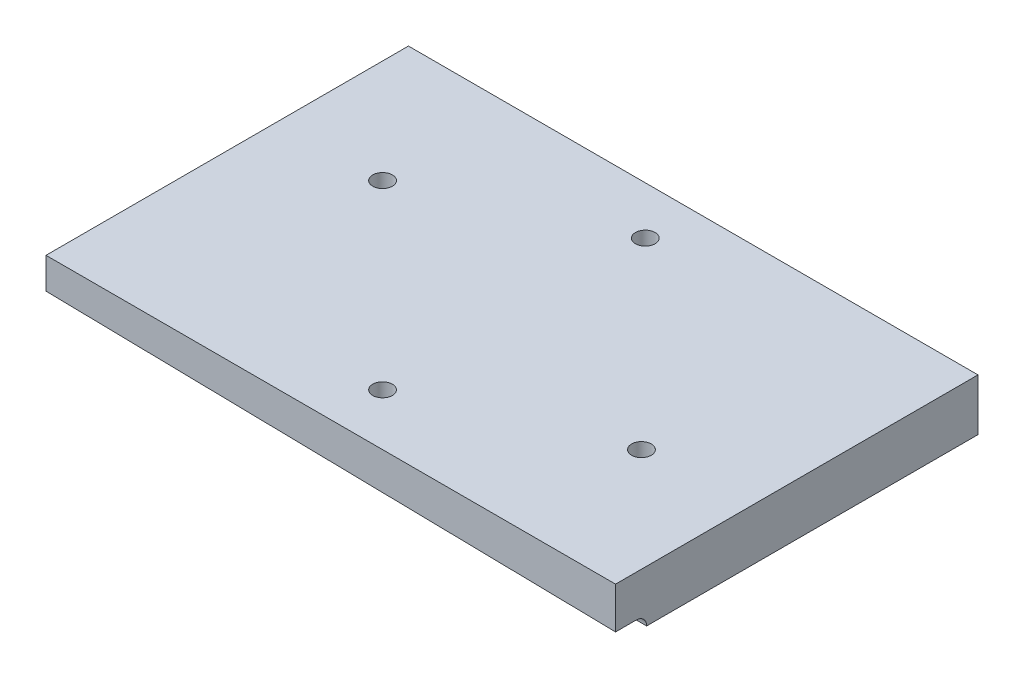
ISO-10303-21;
HEADER;
FILE_DESCRIPTION(('STEP AP214'),'2;1');
FILE_NAME('part.step','',(''),(''),'','','');
FILE_SCHEMA(('AUTOMOTIVE_DESIGN { 1 0 10303 214 1 1 1 1 }'));
ENDSEC;
DATA;
#1=APPLICATION_CONTEXT('core data for automotive mechanical design processes');
#2=APPLICATION_PROTOCOL_DEFINITION('international standard','automotive_design',2000,#1);
#3=PRODUCT_CONTEXT('',#1,'mechanical');
#4=PRODUCT('Part','Part','',(#3));
#5=PRODUCT_RELATED_PRODUCT_CATEGORY('part','',(#4));
#6=PRODUCT_DEFINITION_FORMATION('','',#4);
#7=PRODUCT_DEFINITION_CONTEXT('part definition',#1,'design');
#8=PRODUCT_DEFINITION('design','',#6,#7);
#9=PRODUCT_DEFINITION_SHAPE('','',#8);
#10=(LENGTH_UNIT() NAMED_UNIT(*) SI_UNIT(.MILLI.,.METRE.));
#11=(NAMED_UNIT(*) PLANE_ANGLE_UNIT() SI_UNIT($,.RADIAN.));
#12=(NAMED_UNIT(*) SI_UNIT($,.STERADIAN.) SOLID_ANGLE_UNIT());
#13=UNCERTAINTY_MEASURE_WITH_UNIT(LENGTH_MEASURE(1.E-05),#10,'distance_accuracy_value','');
#14=(GEOMETRIC_REPRESENTATION_CONTEXT(3) GLOBAL_UNCERTAINTY_ASSIGNED_CONTEXT((#13)) GLOBAL_UNIT_ASSIGNED_CONTEXT((#10,
#11,#12)) REPRESENTATION_CONTEXT('',''));
#15=CARTESIAN_POINT('',(0.,0.,0.));
#16=DIRECTION('',(0.,0.,1.));
#17=DIRECTION('',(1.,0.,0.));
#18=AXIS2_PLACEMENT_3D('',#15,#16,#17);
#19=CARTESIAN_POINT('',(-45.1305913271504,10.,-39.3903610709062));
#20=DIRECTION('',(0.,0.,-1.));
#21=DIRECTION('',(-1.,0.,0.));
#22=AXIS2_PLACEMENT_3D('',#19,#20,#21);
#23=PLANE('',#22);
#24=DIRECTION('',(1.,0.,0.));
#25=VECTOR('',#24,1.);
#26=CARTESIAN_POINT('',(-45.1305913271504,0.,-39.3903610709062));
#27=LINE('',#26,#25);
#28=CARTESIAN_POINT('',(-45.1305913271504,0.,-39.3903610709062));
#29=VERTEX_POINT('',#28);
#30=CARTESIAN_POINT('',(64.8694086728496,0.,-39.3903610709062));
#31=VERTEX_POINT('',#30);
#32=EDGE_CURVE('E135',#29,#31,#27,.T.);
#33=ORIENTED_EDGE('',*,*,#32,.F.);
#34=DIRECTION('',(0.,-1.,0.));
#35=VECTOR('',#34,1.);
#36=CARTESIAN_POINT('',(-45.1305913271504,10.,-39.3903610709062));
#37=LINE('',#36,#35);
#38=CARTESIAN_POINT('',(-45.1305913271504,10.,-39.3903610709062));
#39=VERTEX_POINT('',#38);
#40=EDGE_CURVE('E113',#39,#29,#37,.T.);
#41=ORIENTED_EDGE('',*,*,#40,.F.);
#42=DIRECTION('',(1.,0.,0.));
#43=VECTOR('',#42,1.);
#44=CARTESIAN_POINT('',(-45.1305913271504,10.,-39.3903610709062));
#45=LINE('',#44,#43);
#46=CARTESIAN_POINT('',(64.8694086728496,10.,-39.3903610709062));
#47=VERTEX_POINT('',#46);
#48=EDGE_CURVE('E157',#39,#47,#45,.T.);
#49=ORIENTED_EDGE('',*,*,#48,.T.);
#50=DIRECTION('',(0.,-1.,0.));
#51=VECTOR('',#50,1.);
#52=CARTESIAN_POINT('',(64.8694086728496,10.,-39.3903610709062));
#53=LINE('',#52,#51);
#54=EDGE_CURVE('E111',#47,#31,#53,.T.);
#55=ORIENTED_EDGE('',*,*,#54,.T.);
#56=EDGE_LOOP('',(#33,#41,#49,#55));
#57=FACE_BOUND('',#56,.T.);
#58=ADVANCED_FACE('F34',(#57),#23,.T.);
#59=CARTESIAN_POINT('',(-45.1305913271504,10.,30.6096389290938));
#60=DIRECTION('',(-1.,0.,0.));
#61=DIRECTION('',(0.,0.,1.));
#62=AXIS2_PLACEMENT_3D('',#59,#60,#61);
#63=PLANE('',#62);
#64=DIRECTION('',(0.,-1.,0.));
#65=VECTOR('',#64,1.);
#66=CARTESIAN_POINT('',(-45.1305913271504,0.,24.6096389290938));
#67=LINE('',#66,#65);
#68=CARTESIAN_POINT('',(-45.1305913271504,1.99966944880363,24.6096389290938));
#69=VERTEX_POINT('',#68);
#70=CARTESIAN_POINT('',(-45.1305913271504,0.,24.6096389290938));
#71=VERTEX_POINT('',#70);
#72=EDGE_CURVE('E96',#69,#71,#67,.T.);
#73=ORIENTED_EDGE('',*,*,#72,.F.);
#74=CARTESIAN_POINT('',(-45.1305913271504,1.99966944880363,26.6096389290938));
#75=DIRECTION('',(-1.,0.,0.));
#76=DIRECTION('',(0.,-1.,0.));
#77=AXIS2_PLACEMENT_3D('',#74,#75,#76);
#78=ELLIPSE('',#77,2.00033055119637,2.);
#79=CARTESIAN_POINT('',(-45.1305913271504,4.,26.6096389290938));
#80=VERTEX_POINT('',#79);
#81=EDGE_CURVE('E124',#69,#80,#78,.F.);
#82=ORIENTED_EDGE('',*,*,#81,.T.);
#83=DIRECTION('',(0.,0.,1.));
#84=VECTOR('',#83,1.);
#85=CARTESIAN_POINT('',(-45.1305913271504,4.,24.6096389290938));
#86=LINE('',#85,#84);
#87=CARTESIAN_POINT('',(-45.1305913271504,4.,30.6096389290938));
#88=VERTEX_POINT('',#87);
#89=EDGE_CURVE('E95',#80,#88,#86,.T.);
#90=ORIENTED_EDGE('',*,*,#89,.T.);
#91=DIRECTION('',(0.,-1.,0.));
#92=VECTOR('',#91,1.);
#93=CARTESIAN_POINT('',(-45.1305913271504,10.,30.6096389290938));
#94=LINE('',#93,#92);
#95=CARTESIAN_POINT('',(-45.1305913271504,10.,30.6096389290938));
#96=VERTEX_POINT('',#95);
#97=EDGE_CURVE('E104',#96,#88,#94,.T.);
#98=ORIENTED_EDGE('',*,*,#97,.F.);
#99=DIRECTION('',(0.,0.,-1.));
#100=VECTOR('',#99,1.);
#101=CARTESIAN_POINT('',(-45.1305913271504,10.,30.6096389290938));
#102=LINE('',#101,#100);
#103=EDGE_CURVE('E116',#96,#39,#102,.T.);
#104=ORIENTED_EDGE('',*,*,#103,.T.);
#105=ORIENTED_EDGE('',*,*,#40,.T.);
#106=DIRECTION('',(0.,0.,-1.));
#107=VECTOR('',#106,1.);
#108=CARTESIAN_POINT('',(-45.1305913271504,0.,30.6096389290938));
#109=LINE('',#108,#107);
#110=EDGE_CURVE('E136',#71,#29,#109,.T.);
#111=ORIENTED_EDGE('',*,*,#110,.F.);
#112=EDGE_LOOP('',(#73,#82,#90,#98,#104,#105,#111));
#113=FACE_BOUND('',#112,.T.);
#114=ADVANCED_FACE('F144',(#113),#63,.T.);
#115=CARTESIAN_POINT('',(-45.1305913271504,10.,30.6096389290938));
#116=DIRECTION('',(0.,0.,-1.));
#117=DIRECTION('',(-1.,0.,0.));
#118=AXIS2_PLACEMENT_3D('',#115,#116,#117);
#119=PLANE('',#118);
#120=ORIENTED_EDGE('',*,*,#97,.T.);
#121=DIRECTION('',(-0.999834751713323,0.018178813667515,0.));
#122=VECTOR('',#121,1.);
#123=CARTESIAN_POINT('',(-45.1305913271504,4.,30.6096389290938));
#124=LINE('',#123,#122);
#125=CARTESIAN_POINT('',(64.8694086728496,2.,30.6096389290938));
#126=VERTEX_POINT('',#125);
#127=EDGE_CURVE('E89',#126,#88,#124,.T.);
#128=ORIENTED_EDGE('',*,*,#127,.F.);
#129=DIRECTION('',(0.,-1.,0.));
#130=VECTOR('',#129,1.);
#131=CARTESIAN_POINT('',(64.8694086728496,10.,30.6096389290938));
#132=LINE('',#131,#130);
#133=CARTESIAN_POINT('',(64.8694086728496,10.,30.6096389290938));
#134=VERTEX_POINT('',#133);
#135=EDGE_CURVE('E102',#134,#126,#132,.T.);
#136=ORIENTED_EDGE('',*,*,#135,.F.);
#137=DIRECTION('',(1.,0.,0.));
#138=VECTOR('',#137,1.);
#139=CARTESIAN_POINT('',(-45.1305913271504,10.,30.6096389290938));
#140=LINE('',#139,#138);
#141=EDGE_CURVE('E161',#96,#134,#140,.T.);
#142=ORIENTED_EDGE('',*,*,#141,.F.);
#143=EDGE_LOOP('',(#120,#128,#136,#142));
#144=FACE_BOUND('',#143,.T.);
#145=ADVANCED_FACE('F100',(#144),#119,.F.);
#146=CARTESIAN_POINT('',(64.8694086728496,10.,30.6096389290938));
#147=DIRECTION('',(-1.,0.,0.));
#148=DIRECTION('',(0.,0.,1.));
#149=AXIS2_PLACEMENT_3D('',#146,#147,#148);
#150=PLANE('',#149);
#151=ORIENTED_EDGE('',*,*,#135,.T.);
#152=DIRECTION('',(0.,0.,1.));
#153=VECTOR('',#152,1.);
#154=CARTESIAN_POINT('',(64.8694086728496,2.,24.6096389290938));
#155=LINE('',#154,#153);
#156=CARTESIAN_POINT('',(64.8694086728496,2.,26.6096389290938));
#157=VERTEX_POINT('',#156);
#158=EDGE_CURVE('E86',#157,#126,#155,.T.);
#159=ORIENTED_EDGE('',*,*,#158,.F.);
#160=CARTESIAN_POINT('',(64.8694086728496,-0.000330551196373041,26.6096389290938));
#161=DIRECTION('',(-1.,0.,0.));
#162=DIRECTION('',(0.,-1.,0.));
#163=AXIS2_PLACEMENT_3D('',#160,#161,#162);
#164=ELLIPSE('',#163,2.00033055119637,2.);
#165=CARTESIAN_POINT('',(64.8694086728496,0.,24.6096389564008));
#166=VERTEX_POINT('',#165);
#167=EDGE_CURVE('E43',#157,#166,#164,.T.);
#168=ORIENTED_EDGE('',*,*,#167,.T.);
#169=DIRECTION('',(0.,0.,-1.));
#170=VECTOR('',#169,1.);
#171=CARTESIAN_POINT('',(64.8694086728496,0.,30.6096389290938));
#172=LINE('',#171,#170);
#173=EDGE_CURVE('E126',#166,#31,#172,.T.);
#174=ORIENTED_EDGE('',*,*,#173,.T.);
#175=ORIENTED_EDGE('',*,*,#54,.F.);
#176=DIRECTION('',(0.,0.,-1.));
#177=VECTOR('',#176,1.);
#178=CARTESIAN_POINT('',(64.8694086728496,10.,30.6096389290938));
#179=LINE('',#178,#177);
#180=EDGE_CURVE('E110',#134,#47,#179,.T.);
#181=ORIENTED_EDGE('',*,*,#180,.F.);
#182=EDGE_LOOP('',(#151,#159,#168,#174,#175,#181));
#183=FACE_BOUND('',#182,.T.);
#184=ADVANCED_FACE('F108',(#183),#150,.F.);
#185=CARTESIAN_POINT('',(0.,10.,0.));
#186=DIRECTION('',(0.,1.,0.));
#187=DIRECTION('',(0.,0.,1.));
#188=AXIS2_PLACEMENT_3D('',#185,#186,#187);
#189=PLANE('',#188);
#190=CARTESIAN_POINT('',(-25.1305913271504,10.,-14.3903610709062));
#191=DIRECTION('',(0.,-1.,0.));
#192=DIRECTION('',(0.,0.,-1.));
#193=AXIS2_PLACEMENT_3D('',#190,#191,#192);
#194=CIRCLE('',#193,1.9);
#195=CARTESIAN_POINT('',(-25.1305913271504,10.,-16.2903610709062));
#196=VERTEX_POINT('',#195);
#197=EDGE_CURVE('E275',#196,#196,#194,.T.);
#198=ORIENTED_EDGE('',*,*,#197,.T.);
#199=EDGE_LOOP('',(#198));
#200=FACE_BOUND('',#199,.T.);
#201=CARTESIAN_POINT('',(44.8694086728496,10.,5.60963892909377));
#202=DIRECTION('',(0.,-1.,0.));
#203=DIRECTION('',(0.,0.,-1.));
#204=AXIS2_PLACEMENT_3D('',#201,#202,#203);
#205=CIRCLE('',#204,1.9);
#206=CARTESIAN_POINT('',(44.8694086728496,10.,3.70963892909377));
#207=VERTEX_POINT('',#206);
#208=EDGE_CURVE('E283',#207,#207,#205,.T.);
#209=ORIENTED_EDGE('',*,*,#208,.T.);
#210=EDGE_LOOP('',(#209));
#211=FACE_BOUND('',#210,.T.);
#212=CARTESIAN_POINT('',(9.86940867284957,10.,-30.128732457806));
#213=DIRECTION('',(0.,-1.,0.));
#214=DIRECTION('',(0.,0.,-1.));
#215=AXIS2_PLACEMENT_3D('',#212,#213,#214);
#216=CIRCLE('',#215,1.9);
#217=CARTESIAN_POINT('',(9.86940867284957,10.,-32.028732457806));
#218=VERTEX_POINT('',#217);
#219=EDGE_CURVE('E106',#218,#218,#216,.T.);
#220=ORIENTED_EDGE('',*,*,#219,.T.);
#221=EDGE_LOOP('',(#220));
#222=FACE_BOUND('',#221,.T.);
#223=CARTESIAN_POINT('',(9.86940867284957,10.,20.6096389290938));
#224=DIRECTION('',(0.,1.,0.));
#225=DIRECTION('',(0.,0.,1.));
#226=AXIS2_PLACEMENT_3D('',#223,#224,#225);
#227=CIRCLE('',#226,1.9);
#228=CARTESIAN_POINT('',(9.86940867284957,10.,22.5096389290938));
#229=VERTEX_POINT('',#228);
#230=EDGE_CURVE('E150',#229,#229,#227,.T.);
#231=ORIENTED_EDGE('',*,*,#230,.F.);
#232=EDGE_LOOP('',(#231));
#233=FACE_BOUND('',#232,.T.);
#234=ORIENTED_EDGE('',*,*,#48,.F.);
#235=ORIENTED_EDGE('',*,*,#103,.F.);
#236=ORIENTED_EDGE('',*,*,#141,.T.);
#237=ORIENTED_EDGE('',*,*,#180,.T.);
#238=EDGE_LOOP('',(#234,#235,#236,#237));
#239=FACE_BOUND('',#238,.T.);
#240=ADVANCED_FACE('F170',(#200,#211,#222,#233,#239),#189,.T.);
#241=CARTESIAN_POINT('',(0.,0.,0.));
#242=DIRECTION('',(0.,1.,0.));
#243=DIRECTION('',(0.,0.,1.));
#244=AXIS2_PLACEMENT_3D('',#241,#242,#243);
#245=PLANE('',#244);
#246=CARTESIAN_POINT('',(-25.1305913271504,0.,-14.3903610709062));
#247=DIRECTION('',(0.,-1.,0.));
#248=DIRECTION('',(0.,0.,-1.));
#249=AXIS2_PLACEMENT_3D('',#246,#247,#248);
#250=CIRCLE('',#249,1.9);
#251=CARTESIAN_POINT('',(-25.1305913271504,0.,-16.2903610709062));
#252=VERTEX_POINT('',#251);
#253=EDGE_CURVE('E278',#252,#252,#250,.T.);
#254=ORIENTED_EDGE('',*,*,#253,.F.);
#255=EDGE_LOOP('',(#254));
#256=FACE_BOUND('',#255,.T.);
#257=CARTESIAN_POINT('',(44.8694086728496,0.,5.60963892909377));
#258=DIRECTION('',(0.,-1.,0.));
#259=DIRECTION('',(0.,0.,-1.));
#260=AXIS2_PLACEMENT_3D('',#257,#258,#259);
#261=CIRCLE('',#260,1.9);
#262=CARTESIAN_POINT('',(44.8694086728496,0.,3.70963892909377));
#263=VERTEX_POINT('',#262);
#264=EDGE_CURVE('E280',#263,#263,#261,.T.);
#265=ORIENTED_EDGE('',*,*,#264,.F.);
#266=EDGE_LOOP('',(#265));
#267=FACE_BOUND('',#266,.T.);
#268=CARTESIAN_POINT('',(9.86940867284957,0.,-30.128732457806));
#269=DIRECTION('',(0.,-1.,0.));
#270=DIRECTION('',(0.,0.,-1.));
#271=AXIS2_PLACEMENT_3D('',#268,#269,#270);
#272=CIRCLE('',#271,1.9);
#273=CARTESIAN_POINT('',(9.86940867284957,0.,-32.028732457806));
#274=VERTEX_POINT('',#273);
#275=EDGE_CURVE('E286',#274,#274,#272,.T.);
#276=ORIENTED_EDGE('',*,*,#275,.F.);
#277=EDGE_LOOP('',(#276));
#278=FACE_BOUND('',#277,.T.);
#279=CARTESIAN_POINT('',(9.86940867284957,0.,20.6096389290938));
#280=DIRECTION('',(0.,1.,0.));
#281=DIRECTION('',(0.,0.,1.));
#282=AXIS2_PLACEMENT_3D('',#279,#280,#281);
#283=CIRCLE('',#282,1.9);
#284=CARTESIAN_POINT('',(9.86940867284957,0.,22.5096389290938));
#285=VERTEX_POINT('',#284);
#286=EDGE_CURVE('E152',#285,#285,#283,.T.);
#287=ORIENTED_EDGE('',*,*,#286,.T.);
#288=EDGE_LOOP('',(#287));
#289=FACE_BOUND('',#288,.T.);
#290=ORIENTED_EDGE('',*,*,#173,.F.);
#291=CARTESIAN_POINT('',(64.851228357049,0.,26.6096389290938));
#292=DIRECTION('',(0.,1.,0.));
#293=DIRECTION('',(1.,0.,0.));
#294=AXIS2_PLACEMENT_3D('',#291,#292,#293);
#295=ELLIPSE('',#294,110.018180315801,2.);
#296=CARTESIAN_POINT('',(64.8512283570491,0.,24.6096389290938));
#297=VERTEX_POINT('',#296);
#298=EDGE_CURVE('E11',#166,#297,#295,.T.);
#299=ORIENTED_EDGE('',*,*,#298,.T.);
#300=DIRECTION('',(1.,0.,0.));
#301=VECTOR('',#300,1.);
#302=CARTESIAN_POINT('',(64.8694086728496,0.,24.6096389290938));
#303=LINE('',#302,#301);
#304=EDGE_CURVE('E105',#71,#297,#303,.T.);
#305=ORIENTED_EDGE('',*,*,#304,.F.);
#306=ORIENTED_EDGE('',*,*,#110,.T.);
#307=ORIENTED_EDGE('',*,*,#32,.T.);
#308=EDGE_LOOP('',(#290,#299,#305,#306,#307));
#309=FACE_BOUND('',#308,.T.);
#310=ADVANCED_FACE('F131',(#256,#267,#278,#289,#309),#245,.F.);
#311=CARTESIAN_POINT('',(9.86940867284957,0.,20.6096389290938));
#312=DIRECTION('',(0.,1.,0.));
#313=DIRECTION('',(0.,0.,1.));
#314=AXIS2_PLACEMENT_3D('',#311,#312,#313);
#315=CYLINDRICAL_SURFACE('',#314,1.9);
#316=ORIENTED_EDGE('',*,*,#286,.F.);
#317=EDGE_LOOP('',(#316));
#318=FACE_BOUND('',#317,.T.);
#319=ORIENTED_EDGE('',*,*,#230,.T.);
#320=EDGE_LOOP('',(#319));
#321=FACE_BOUND('',#320,.T.);
#322=ADVANCED_FACE('F178',(#318,#321),#315,.F.);
#323=CARTESIAN_POINT('',(-45.1305913271504,4.,24.6096389290938));
#324=DIRECTION('',(0.018178813667515,0.999834751713323,0.));
#325=DIRECTION('',(-0.999834751713323,0.018178813667515,0.));
#326=AXIS2_PLACEMENT_3D('',#323,#324,#325);
#327=PLANE('',#326);
#328=ORIENTED_EDGE('',*,*,#89,.F.);
#329=DIRECTION('',(-0.999834751713323,0.018178813667515,0.));
#330=VECTOR('',#329,1.);
#331=CARTESIAN_POINT('',(64.8694086728496,2.,26.6096389290938));
#332=LINE('',#331,#330);
#333=EDGE_CURVE('E50',#80,#157,#332,.F.);
#334=ORIENTED_EDGE('',*,*,#333,.T.);
#335=ORIENTED_EDGE('',*,*,#158,.T.);
#336=ORIENTED_EDGE('',*,*,#127,.T.);
#337=EDGE_LOOP('',(#328,#334,#335,#336));
#338=FACE_BOUND('',#337,.T.);
#339=ADVANCED_FACE('F88',(#338),#327,.F.);
#340=CARTESIAN_POINT('',(0.,0.,24.6096389290938));
#341=DIRECTION('',(0.,0.,-1.));
#342=DIRECTION('',(-1.,0.,0.));
#343=AXIS2_PLACEMENT_3D('',#340,#341,#342);
#344=PLANE('',#343);
#345=ORIENTED_EDGE('',*,*,#304,.T.);
#346=DIRECTION('',(-0.999834751713323,0.018178813667515,0.));
#347=VECTOR('',#346,1.);
#348=CARTESIAN_POINT('',(-45.1669489544855,2.00033049657336,24.6096389290938));
#349=LINE('',#348,#347);
#350=EDGE_CURVE('E120',#297,#69,#349,.T.);
#351=ORIENTED_EDGE('',*,*,#350,.T.);
#352=ORIENTED_EDGE('',*,*,#72,.T.);
#353=EDGE_LOOP('',(#345,#351,#352));
#354=FACE_BOUND('',#353,.T.);
#355=ADVANCED_FACE('F141',(#354),#344,.F.);
#356=CARTESIAN_POINT('',(9.86940867284957,10.,-30.128732457806));
#357=DIRECTION('',(0.,-1.,0.));
#358=DIRECTION('',(0.,0.,-1.));
#359=AXIS2_PLACEMENT_3D('',#356,#357,#358);
#360=CYLINDRICAL_SURFACE('',#359,1.9);
#361=ORIENTED_EDGE('',*,*,#219,.F.);
#362=EDGE_LOOP('',(#361));
#363=FACE_BOUND('',#362,.T.);
#364=ORIENTED_EDGE('',*,*,#275,.T.);
#365=EDGE_LOOP('',(#364));
#366=FACE_BOUND('',#365,.T.);
#367=ADVANCED_FACE('F231',(#363,#366),#360,.F.);
#368=CARTESIAN_POINT('',(0.021431337857584,1.17872358216712,26.6096389290938));
#369=DIRECTION('',(0.999834751713323,-0.018178813667515,0.));
#370=DIRECTION('',(0.018178813667515,0.999834751713323,0.));
#371=AXIS2_PLACEMENT_3D('',#368,#369,#370);
#372=CYLINDRICAL_SURFACE('',#371,2.);
#373=ORIENTED_EDGE('',*,*,#167,.F.);
#374=ORIENTED_EDGE('',*,*,#333,.F.);
#375=ORIENTED_EDGE('',*,*,#81,.F.);
#376=ORIENTED_EDGE('',*,*,#350,.F.);
#377=ORIENTED_EDGE('',*,*,#298,.F.);
#378=EDGE_LOOP('',(#373,#374,#375,#376,#377));
#379=FACE_BOUND('',#378,.T.);
#380=ADVANCED_FACE('F36',(#379),#372,.F.);
#381=CARTESIAN_POINT('',(44.8694086728496,10.,5.60963892909377));
#382=DIRECTION('',(0.,-1.,0.));
#383=DIRECTION('',(0.,0.,-1.));
#384=AXIS2_PLACEMENT_3D('',#381,#382,#383);
#385=CYLINDRICAL_SURFACE('',#384,1.9);
#386=ORIENTED_EDGE('',*,*,#208,.F.);
#387=EDGE_LOOP('',(#386));
#388=FACE_BOUND('',#387,.T.);
#389=ORIENTED_EDGE('',*,*,#264,.T.);
#390=EDGE_LOOP('',(#389));
#391=FACE_BOUND('',#390,.T.);
#392=ADVANCED_FACE('F244',(#388,#391),#385,.F.);
#393=CARTESIAN_POINT('',(-25.1305913271504,10.,-14.3903610709062));
#394=DIRECTION('',(0.,-1.,0.));
#395=DIRECTION('',(0.,0.,-1.));
#396=AXIS2_PLACEMENT_3D('',#393,#394,#395);
#397=CYLINDRICAL_SURFACE('',#396,1.9);
#398=ORIENTED_EDGE('',*,*,#197,.F.);
#399=EDGE_LOOP('',(#398));
#400=FACE_BOUND('',#399,.T.);
#401=ORIENTED_EDGE('',*,*,#253,.T.);
#402=EDGE_LOOP('',(#401));
#403=FACE_BOUND('',#402,.T.);
#404=ADVANCED_FACE('F249',(#400,#403),#397,.F.);
#405=CLOSED_SHELL('',(#58,#114,#145,#184,#240,#310,#322,#339,#355,#367,#380,#392,#404));
#406=MANIFOLD_SOLID_BREP('B2',#405);
#407=ADVANCED_BREP_SHAPE_REPRESENTATION('',(#18,#406),#14);
#408=SHAPE_DEFINITION_REPRESENTATION(#9,#407);
ENDSEC;
END-ISO-10303-21;
